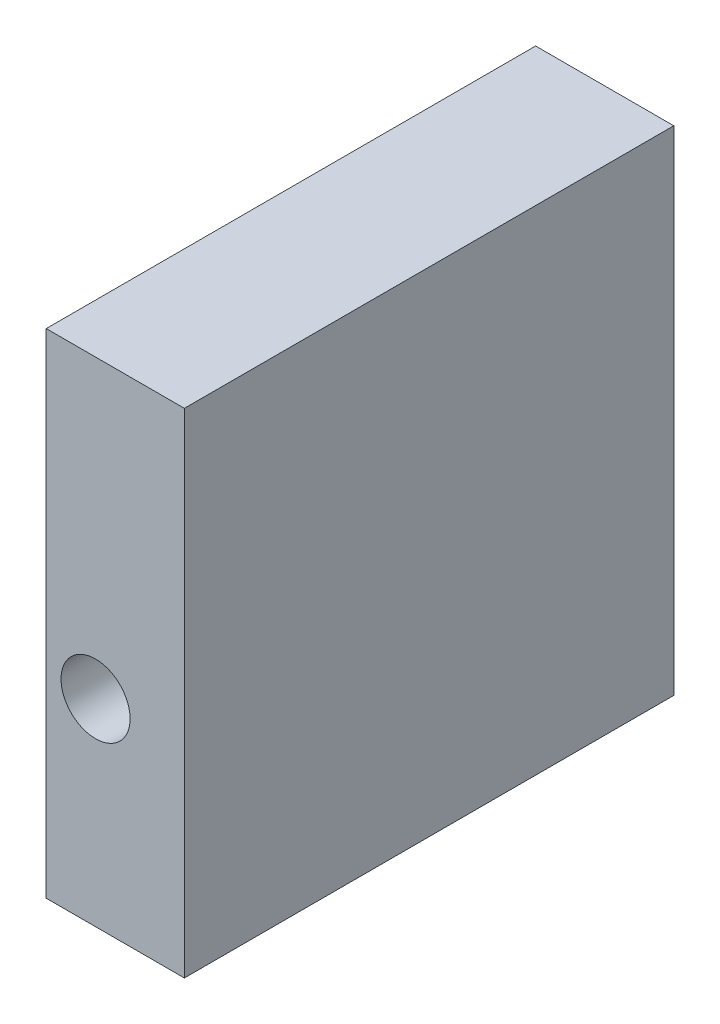
ISO-10303-21;
HEADER;
FILE_DESCRIPTION(('STEP AP214'),'2;1');
FILE_NAME('part.step','',(''),(''),'','','');
FILE_SCHEMA(('AUTOMOTIVE_DESIGN { 1 0 10303 214 1 1 1 1 }'));
ENDSEC;
DATA;
#1=APPLICATION_CONTEXT('core data for automotive mechanical design processes');
#2=APPLICATION_PROTOCOL_DEFINITION('international standard','automotive_design',2000,#1);
#3=PRODUCT_CONTEXT('',#1,'mechanical');
#4=PRODUCT('Part','Part','',(#3));
#5=PRODUCT_RELATED_PRODUCT_CATEGORY('part','',(#4));
#6=PRODUCT_DEFINITION_FORMATION('','',#4);
#7=PRODUCT_DEFINITION_CONTEXT('part definition',#1,'design');
#8=PRODUCT_DEFINITION('design','',#6,#7);
#9=PRODUCT_DEFINITION_SHAPE('','',#8);
#10=(LENGTH_UNIT() NAMED_UNIT(*) SI_UNIT(.MILLI.,.METRE.));
#11=(NAMED_UNIT(*) PLANE_ANGLE_UNIT() SI_UNIT($,.RADIAN.));
#12=(NAMED_UNIT(*) SI_UNIT($,.STERADIAN.) SOLID_ANGLE_UNIT());
#13=UNCERTAINTY_MEASURE_WITH_UNIT(LENGTH_MEASURE(1.E-05),#10,'distance_accuracy_value','');
#14=(GEOMETRIC_REPRESENTATION_CONTEXT(3) GLOBAL_UNCERTAINTY_ASSIGNED_CONTEXT((#13)) GLOBAL_UNIT_ASSIGNED_CONTEXT((#10,
#11,#12)) REPRESENTATION_CONTEXT('',''));
#15=CARTESIAN_POINT('',(0.,0.,0.));
#16=DIRECTION('',(0.,0.,1.));
#17=DIRECTION('',(1.,0.,0.));
#18=AXIS2_PLACEMENT_3D('',#15,#16,#17);
#19=CARTESIAN_POINT('',(61.2049763649196,-55.1107059078754,50.7615099714943));
#20=DIRECTION('',(1.,0.,0.));
#21=DIRECTION('',(0.,0.,-1.));
#22=AXIS2_PLACEMENT_3D('',#19,#20,#21);
#23=PLANE('',#22);
#24=DIRECTION('',(0.,-1.,0.));
#25=VECTOR('',#24,1.);
#26=CARTESIAN_POINT('',(61.2049763649196,-55.1107059078754,24.8));
#27=LINE('',#26,#25);
#28=CARTESIAN_POINT('',(61.2049763649196,-55.1107059078754,24.8));
#29=VERTEX_POINT('',#28);
#30=CARTESIAN_POINT('',(61.2049763649196,-80.1107059078754,24.8));
#31=VERTEX_POINT('',#30);
#32=EDGE_CURVE('E90',#29,#31,#27,.T.);
#33=ORIENTED_EDGE('',*,*,#32,.F.);
#34=DIRECTION('',(0.,0.,-1.));
#35=VECTOR('',#34,1.);
#36=CARTESIAN_POINT('',(61.2049763649196,-55.1107059078754,50.7615099714943));
#37=LINE('',#36,#35);
#38=CARTESIAN_POINT('',(61.2049763649196,-55.1107059078754,0.));
#39=VERTEX_POINT('',#38);
#40=EDGE_CURVE('E43',#29,#39,#37,.T.);
#41=ORIENTED_EDGE('',*,*,#40,.T.);
#42=DIRECTION('',(0.,-1.,0.));
#43=VECTOR('',#42,1.);
#44=CARTESIAN_POINT('',(61.2049763649196,-55.1107059078754,0.));
#45=LINE('',#44,#43);
#46=CARTESIAN_POINT('',(61.2049763649196,-80.1107059078754,0.));
#47=VERTEX_POINT('',#46);
#48=EDGE_CURVE('E87',#39,#47,#45,.T.);
#49=ORIENTED_EDGE('',*,*,#48,.T.);
#50=DIRECTION('',(0.,0.,-1.));
#51=VECTOR('',#50,1.);
#52=CARTESIAN_POINT('',(61.2049763649196,-80.1107059078754,50.7615099714943));
#53=LINE('',#52,#51);
#54=EDGE_CURVE('E76',#31,#47,#53,.T.);
#55=ORIENTED_EDGE('',*,*,#54,.F.);
#56=EDGE_LOOP('',(#33,#41,#49,#55));
#57=FACE_BOUND('',#56,.T.);
#58=ADVANCED_FACE('F39',(#57),#23,.F.);
#59=CARTESIAN_POINT('',(61.2049763649196,-80.1107059078754,50.7615099714943));
#60=DIRECTION('',(0.,1.,0.));
#61=DIRECTION('',(0.,0.,1.));
#62=AXIS2_PLACEMENT_3D('',#59,#60,#61);
#63=PLANE('',#62);
#64=DIRECTION('',(1.,0.,0.));
#65=VECTOR('',#64,1.);
#66=CARTESIAN_POINT('',(61.2049763649196,-80.1107059078754,24.8));
#67=LINE('',#66,#65);
#68=CARTESIAN_POINT('',(68.2049763649196,-80.1107059078754,24.8));
#69=VERTEX_POINT('',#68);
#70=EDGE_CURVE('E48',#31,#69,#67,.T.);
#71=ORIENTED_EDGE('',*,*,#70,.F.);
#72=ORIENTED_EDGE('',*,*,#54,.T.);
#73=DIRECTION('',(1.,0.,0.));
#74=VECTOR('',#73,1.);
#75=CARTESIAN_POINT('',(61.2049763649196,-80.1107059078754,0.));
#76=LINE('',#75,#74);
#77=CARTESIAN_POINT('',(68.2049763649196,-80.1107059078754,0.));
#78=VERTEX_POINT('',#77);
#79=EDGE_CURVE('E99',#47,#78,#76,.T.);
#80=ORIENTED_EDGE('',*,*,#79,.T.);
#81=DIRECTION('',(0.,0.,-1.));
#82=VECTOR('',#81,1.);
#83=CARTESIAN_POINT('',(68.2049763649196,-80.1107059078754,50.7615099714943));
#84=LINE('',#83,#82);
#85=EDGE_CURVE('E108',#69,#78,#84,.T.);
#86=ORIENTED_EDGE('',*,*,#85,.F.);
#87=EDGE_LOOP('',(#71,#72,#80,#86));
#88=FACE_BOUND('',#87,.T.);
#89=ADVANCED_FACE('F129',(#88),#63,.F.);
#90=CARTESIAN_POINT('',(68.2049763649196,-55.1107059078754,50.7615099714943));
#91=DIRECTION('',(-1.,0.,0.));
#92=DIRECTION('',(0.,0.,1.));
#93=AXIS2_PLACEMENT_3D('',#90,#91,#92);
#94=PLANE('',#93);
#95=DIRECTION('',(0.,1.,0.));
#96=VECTOR('',#95,1.);
#97=CARTESIAN_POINT('',(68.2049763649196,-55.1107059078754,24.8));
#98=LINE('',#97,#96);
#99=CARTESIAN_POINT('',(68.2049763649196,-55.1107059078754,24.8));
#100=VERTEX_POINT('',#99);
#101=EDGE_CURVE('E11',#69,#100,#98,.T.);
#102=ORIENTED_EDGE('',*,*,#101,.F.);
#103=ORIENTED_EDGE('',*,*,#85,.T.);
#104=DIRECTION('',(0.,1.,0.));
#105=VECTOR('',#104,1.);
#106=CARTESIAN_POINT('',(68.2049763649196,-55.1107059078754,0.));
#107=LINE('',#106,#105);
#108=CARTESIAN_POINT('',(68.2049763649196,-55.1107059078754,0.));
#109=VERTEX_POINT('',#108);
#110=EDGE_CURVE('E109',#78,#109,#107,.T.);
#111=ORIENTED_EDGE('',*,*,#110,.T.);
#112=DIRECTION('',(0.,0.,-1.));
#113=VECTOR('',#112,1.);
#114=CARTESIAN_POINT('',(68.2049763649196,-55.1107059078754,50.7615099714943));
#115=LINE('',#114,#113);
#116=EDGE_CURVE('E63',#100,#109,#115,.T.);
#117=ORIENTED_EDGE('',*,*,#116,.F.);
#118=EDGE_LOOP('',(#102,#103,#111,#117));
#119=FACE_BOUND('',#118,.T.);
#120=ADVANCED_FACE('F126',(#119),#94,.F.);
#121=CARTESIAN_POINT('',(61.2049763649196,-55.1107059078754,50.7615099714943));
#122=DIRECTION('',(0.,-1.,0.));
#123=DIRECTION('',(0.,0.,-1.));
#124=AXIS2_PLACEMENT_3D('',#121,#122,#123);
#125=PLANE('',#124);
#126=DIRECTION('',(-1.,0.,0.));
#127=VECTOR('',#126,1.);
#128=CARTESIAN_POINT('',(61.2049763649196,-55.1107059078754,24.8));
#129=LINE('',#128,#127);
#130=EDGE_CURVE('E100',#100,#29,#129,.T.);
#131=ORIENTED_EDGE('',*,*,#130,.F.);
#132=ORIENTED_EDGE('',*,*,#116,.T.);
#133=DIRECTION('',(-1.,0.,0.));
#134=VECTOR('',#133,1.);
#135=CARTESIAN_POINT('',(61.2049763649196,-55.1107059078754,0.));
#136=LINE('',#135,#134);
#137=EDGE_CURVE('E91',#109,#39,#136,.T.);
#138=ORIENTED_EDGE('',*,*,#137,.T.);
#139=ORIENTED_EDGE('',*,*,#40,.F.);
#140=EDGE_LOOP('',(#131,#132,#138,#139));
#141=FACE_BOUND('',#140,.T.);
#142=ADVANCED_FACE('F94',(#141),#125,.F.);
#143=CARTESIAN_POINT('',(0.,0.,0.));
#144=DIRECTION('',(0.,0.,1.));
#145=DIRECTION('',(1.,0.,0.));
#146=AXIS2_PLACEMENT_3D('',#143,#144,#145);
#147=PLANE('',#146);
#148=CARTESIAN_POINT('',(63.7049763649196,-70.1107059078754,0.));
#149=DIRECTION('',(0.,0.,1.));
#150=DIRECTION('',(1.,0.,0.));
#151=AXIS2_PLACEMENT_3D('',#148,#149,#150);
#152=CIRCLE('',#151,1.75);
#153=CARTESIAN_POINT('',(65.4549763649196,-70.1107059078754,0.));
#154=VERTEX_POINT('',#153);
#155=EDGE_CURVE('E93',#154,#154,#152,.T.);
#156=ORIENTED_EDGE('',*,*,#155,.T.);
#157=EDGE_LOOP('',(#156));
#158=FACE_BOUND('',#157,.T.);
#159=ORIENTED_EDGE('',*,*,#48,.F.);
#160=ORIENTED_EDGE('',*,*,#137,.F.);
#161=ORIENTED_EDGE('',*,*,#110,.F.);
#162=ORIENTED_EDGE('',*,*,#79,.F.);
#163=EDGE_LOOP('',(#159,#160,#161,#162));
#164=FACE_BOUND('',#163,.T.);
#165=ADVANCED_FACE('F97',(#158,#164),#147,.F.);
#166=CARTESIAN_POINT('',(67.,-55.1107059078754,24.8));
#167=DIRECTION('',(0.,0.,1.));
#168=DIRECTION('',(1.,0.,0.));
#169=AXIS2_PLACEMENT_3D('',#166,#167,#168);
#170=PLANE('',#169);
#171=CARTESIAN_POINT('',(63.7049763649196,-70.1107059078754,24.8));
#172=DIRECTION('',(0.,0.,1.));
#173=DIRECTION('',(1.,0.,0.));
#174=AXIS2_PLACEMENT_3D('',#171,#172,#173);
#175=CIRCLE('',#174,1.75);
#176=CARTESIAN_POINT('',(65.4549763649196,-70.1107059078754,24.8));
#177=VERTEX_POINT('',#176);
#178=EDGE_CURVE('E114',#177,#177,#175,.T.);
#179=ORIENTED_EDGE('',*,*,#178,.F.);
#180=EDGE_LOOP('',(#179));
#181=FACE_BOUND('',#180,.T.);
#182=ORIENTED_EDGE('',*,*,#130,.T.);
#183=ORIENTED_EDGE('',*,*,#32,.T.);
#184=ORIENTED_EDGE('',*,*,#70,.T.);
#185=ORIENTED_EDGE('',*,*,#101,.T.);
#186=EDGE_LOOP('',(#182,#183,#184,#185));
#187=FACE_BOUND('',#186,.T.);
#188=ADVANCED_FACE('F41',(#181,#187),#170,.T.);
#189=CARTESIAN_POINT('',(63.7049763649196,-70.1107059078754,0.));
#190=DIRECTION('',(0.,0.,1.));
#191=DIRECTION('',(1.,0.,0.));
#192=AXIS2_PLACEMENT_3D('',#189,#190,#191);
#193=CYLINDRICAL_SURFACE('',#192,1.75);
#194=CARTESIAN_POINT('',(65.4549763649196,-70.1107059078754,0.));
#195=CARTESIAN_POINT('',(65.4549763649196,-70.1107059078754,0.258333333333333));
#196=CARTESIAN_POINT('',(65.4549763649196,-70.1107059078754,0.516666666666666));
#197=CARTESIAN_POINT('',(65.4549763649196,-70.1107059078754,1.03333333333333));
#198=CARTESIAN_POINT('',(65.4549763649196,-70.1107059078754,1.29166666666667));
#199=CARTESIAN_POINT('',(65.4549763649196,-70.1107059078754,1.80833333333333));
#200=CARTESIAN_POINT('',(65.4549763649196,-70.1107059078754,2.06666666666666));
#201=CARTESIAN_POINT('',(65.4549763649196,-70.1107059078754,2.58333333333333));
#202=CARTESIAN_POINT('',(65.4549763649196,-70.1107059078754,2.84166666666666));
#203=CARTESIAN_POINT('',(65.4549763649196,-70.1107059078754,3.35833333333333));
#204=CARTESIAN_POINT('',(65.4549763649196,-70.1107059078754,3.61666666666666));
#205=CARTESIAN_POINT('',(65.4549763649196,-70.1107059078754,4.13333333333333));
#206=CARTESIAN_POINT('',(65.4549763649196,-70.1107059078754,4.39166666666666));
#207=CARTESIAN_POINT('',(65.4549763649196,-70.1107059078754,4.90833333333333));
#208=CARTESIAN_POINT('',(65.4549763649196,-70.1107059078754,5.16666666666666));
#209=CARTESIAN_POINT('',(65.4549763649196,-70.1107059078754,5.68333333333333));
#210=CARTESIAN_POINT('',(65.4549763649196,-70.1107059078754,5.94166666666666));
#211=CARTESIAN_POINT('',(65.4549763649196,-70.1107059078754,6.45833333333333));
#212=CARTESIAN_POINT('',(65.4549763649196,-70.1107059078754,6.71666666666666));
#213=CARTESIAN_POINT('',(65.4549763649196,-70.1107059078754,7.23333333333333));
#214=CARTESIAN_POINT('',(65.4549763649196,-70.1107059078754,7.49166666666666));
#215=CARTESIAN_POINT('',(65.4549763649196,-70.1107059078754,8.00833333333333));
#216=CARTESIAN_POINT('',(65.4549763649196,-70.1107059078754,8.26666666666666));
#217=CARTESIAN_POINT('',(65.4549763649196,-70.1107059078754,8.78333333333333));
#218=CARTESIAN_POINT('',(65.4549763649196,-70.1107059078754,9.04166666666666));
#219=CARTESIAN_POINT('',(65.4549763649196,-70.1107059078754,9.55833333333332));
#220=CARTESIAN_POINT('',(65.4549763649196,-70.1107059078754,9.81666666666666));
#221=CARTESIAN_POINT('',(65.4549763649196,-70.1107059078754,10.3333333333333));
#222=CARTESIAN_POINT('',(65.4549763649196,-70.1107059078754,10.5916666666667));
#223=CARTESIAN_POINT('',(65.4549763649196,-70.1107059078754,11.1083333333333));
#224=CARTESIAN_POINT('',(65.4549763649196,-70.1107059078754,11.3666666666667));
#225=CARTESIAN_POINT('',(65.4549763649196,-70.1107059078754,11.8833333333333));
#226=CARTESIAN_POINT('',(65.4549763649196,-70.1107059078754,12.1416666666667));
#227=CARTESIAN_POINT('',(65.4549763649196,-70.1107059078754,12.6583333333333));
#228=CARTESIAN_POINT('',(65.4549763649196,-70.1107059078754,12.9166666666667));
#229=CARTESIAN_POINT('',(65.4549763649196,-70.1107059078754,13.4333333333333));
#230=CARTESIAN_POINT('',(65.4549763649196,-70.1107059078754,13.6916666666667));
#231=CARTESIAN_POINT('',(65.4549763649196,-70.1107059078754,14.2083333333333));
#232=CARTESIAN_POINT('',(65.4549763649196,-70.1107059078754,14.4666666666667));
#233=CARTESIAN_POINT('',(65.4549763649196,-70.1107059078754,14.9833333333333));
#234=CARTESIAN_POINT('',(65.4549763649196,-70.1107059078754,15.2416666666667));
#235=CARTESIAN_POINT('',(65.4549763649196,-70.1107059078754,15.7583333333333));
#236=CARTESIAN_POINT('',(65.4549763649196,-70.1107059078754,16.0166666666667));
#237=CARTESIAN_POINT('',(65.4549763649196,-70.1107059078754,16.5333333333333));
#238=CARTESIAN_POINT('',(65.4549763649196,-70.1107059078754,16.7916666666667));
#239=CARTESIAN_POINT('',(65.4549763649196,-70.1107059078754,17.3083333333333));
#240=CARTESIAN_POINT('',(65.4549763649196,-70.1107059078754,17.5666666666667));
#241=CARTESIAN_POINT('',(65.4549763649196,-70.1107059078754,18.0833333333333));
#242=CARTESIAN_POINT('',(65.4549763649196,-70.1107059078754,18.3416666666666));
#243=CARTESIAN_POINT('',(65.4549763649196,-70.1107059078754,18.8583333333333));
#244=CARTESIAN_POINT('',(65.4549763649196,-70.1107059078754,19.1166666666666));
#245=CARTESIAN_POINT('',(65.4549763649196,-70.1107059078754,19.6333333333333));
#246=CARTESIAN_POINT('',(65.4549763649196,-70.1107059078754,19.8916666666666));
#247=CARTESIAN_POINT('',(65.4549763649196,-70.1107059078754,20.4083333333333));
#248=CARTESIAN_POINT('',(65.4549763649196,-70.1107059078754,20.6666666666667));
#249=CARTESIAN_POINT('',(65.4549763649196,-70.1107059078754,21.1833333333333));
#250=CARTESIAN_POINT('',(65.4549763649196,-70.1107059078754,21.4416666666666));
#251=CARTESIAN_POINT('',(65.4549763649196,-70.1107059078754,21.9583333333333));
#252=CARTESIAN_POINT('',(65.4549763649196,-70.1107059078754,22.2166666666666));
#253=CARTESIAN_POINT('',(65.4549763649196,-70.1107059078754,22.7333333333333));
#254=CARTESIAN_POINT('',(65.4549763649196,-70.1107059078754,22.9916666666666));
#255=CARTESIAN_POINT('',(65.4549763649196,-70.1107059078754,23.5083333333333));
#256=CARTESIAN_POINT('',(65.4549763649196,-70.1107059078754,23.7666666666666));
#257=CARTESIAN_POINT('',(65.4549763649196,-70.1107059078754,24.2833333333333));
#258=CARTESIAN_POINT('',(65.4549763649196,-70.1107059078754,24.5416666666666));
#259=CARTESIAN_POINT('',(65.4549763649196,-70.1107059078754,24.8));
#260=B_SPLINE_CURVE_WITH_KNOTS('',3,(#194,#195,#196,#197,#198,#199,#200,#201,#202,#203,#204,
#205,#206,#207,#208,#209,#210,#211,#212,#213,#214,#215,#216,#217,#218,#219,#220,#221,#222,#223,
#224,#225,#226,#227,#228,#229,#230,#231,#232,#233,#234,#235,#236,#237,#238,#239,#240,#241,#242,
#243,#244,#245,#246,#247,#248,#249,#250,#251,#252,#253,#254,#255,#256,#257,#258,#259),
.UNSPECIFIED.,.F.,.F.,(4,2,2,2,2,2,2,2,2,2,2,2,2,2,2,2,2,2,2,2,2,2,2,2,2,2,2,2,2,2,2,2,4),(0.,
0.774999999999999,1.55,2.325,3.1,3.875,4.65,5.42499999999999,6.19999999999999,6.97499999999999,
7.74999999999999,8.52499999999999,9.29999999999999,10.075,10.85,11.625,12.4,13.175,13.95,14.725,
15.5,16.275,17.05,17.825,18.6,19.375,20.15,20.925,21.7,22.475,23.25,24.025,24.8),.UNSPECIFIED.);
#261=EDGE_CURVE('BSEAM119',#154,#177,#260,.T.);
#262=ORIENTED_EDGE('',*,*,#155,.F.);
#263=ORIENTED_EDGE('',*,*,#178,.T.);
#264=ORIENTED_EDGE('',*,*,#261,.T.);
#265=ORIENTED_EDGE('',*,*,#261,.F.);
#266=EDGE_LOOP('',(#262,#264,#263,#265));
#267=FACE_BOUND('',#266,.T.);
#268=ADVANCED_FACE('F119',(#267),#193,.F.);
#269=CLOSED_SHELL('',(#58,#89,#120,#142,#165,#188,#268));
#270=MANIFOLD_SOLID_BREP('B2',#269);
#271=ADVANCED_BREP_SHAPE_REPRESENTATION('',(#18,#270),#14);
#272=SHAPE_DEFINITION_REPRESENTATION(#9,#271);
ENDSEC;
END-ISO-10303-21;
